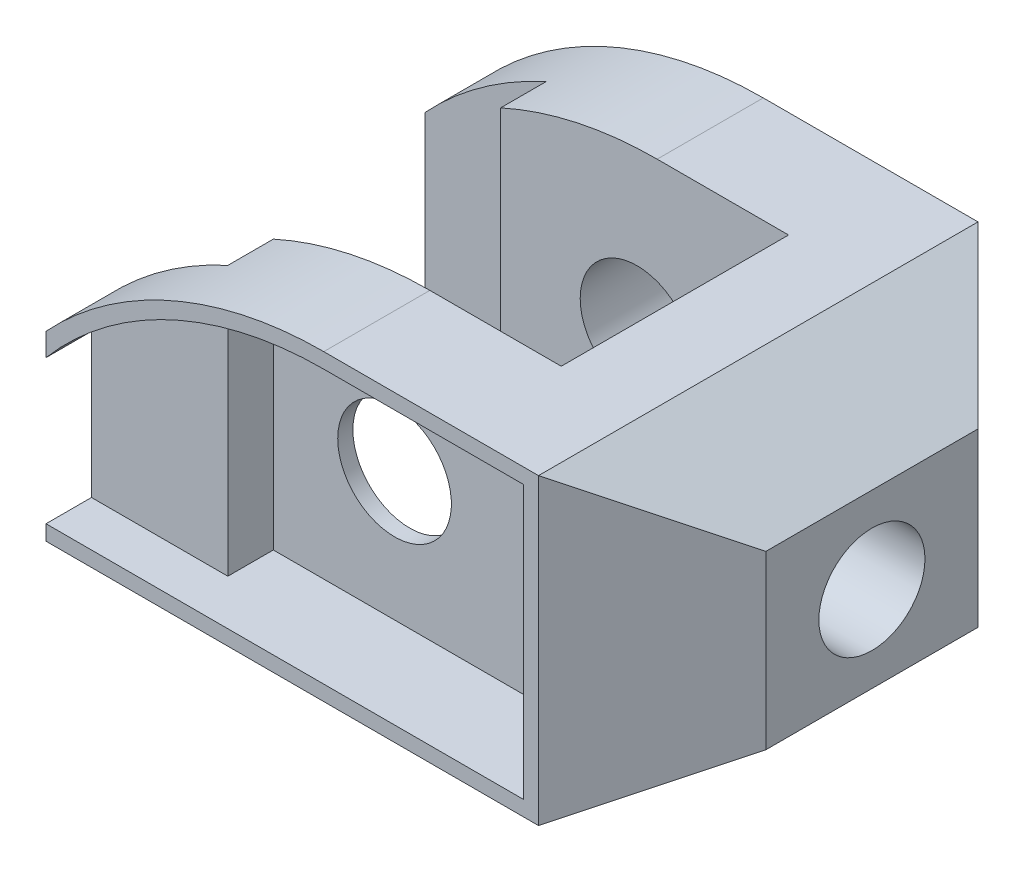
ISO-10303-21;
HEADER;
FILE_DESCRIPTION(('STEP AP214'),'2;1');
FILE_NAME('part.step','',(''),(''),'','','');
FILE_SCHEMA(('AUTOMOTIVE_DESIGN { 1 0 10303 214 1 1 1 1 }'));
ENDSEC;
DATA;
#1=APPLICATION_CONTEXT('core data for automotive mechanical design processes');
#2=APPLICATION_PROTOCOL_DEFINITION('international standard','automotive_design',2000,#1);
#3=PRODUCT_CONTEXT('',#1,'mechanical');
#4=PRODUCT('Part','Part','',(#3));
#5=PRODUCT_RELATED_PRODUCT_CATEGORY('part','',(#4));
#6=PRODUCT_DEFINITION_FORMATION('','',#4);
#7=PRODUCT_DEFINITION_CONTEXT('part definition',#1,'design');
#8=PRODUCT_DEFINITION('design','',#6,#7);
#9=PRODUCT_DEFINITION_SHAPE('','',#8);
#10=(LENGTH_UNIT() NAMED_UNIT(*) SI_UNIT(.MILLI.,.METRE.));
#11=(NAMED_UNIT(*) PLANE_ANGLE_UNIT() SI_UNIT($,.RADIAN.));
#12=(NAMED_UNIT(*) SI_UNIT($,.STERADIAN.) SOLID_ANGLE_UNIT());
#13=UNCERTAINTY_MEASURE_WITH_UNIT(LENGTH_MEASURE(1.E-05),#10,'distance_accuracy_value','');
#14=(GEOMETRIC_REPRESENTATION_CONTEXT(3) GLOBAL_UNCERTAINTY_ASSIGNED_CONTEXT((#13)) GLOBAL_UNIT_ASSIGNED_CONTEXT((#10,
#11,#12)) REPRESENTATION_CONTEXT('',''));
#15=CARTESIAN_POINT('',(0.,0.,0.));
#16=DIRECTION('',(0.,0.,1.));
#17=DIRECTION('',(1.,0.,0.));
#18=AXIS2_PLACEMENT_3D('',#15,#16,#17);
#19=CARTESIAN_POINT('',(18.,0.,17.));
#20=DIRECTION('',(-1.,0.,0.));
#21=DIRECTION('',(0.,-1.,0.));
#22=AXIS2_PLACEMENT_3D('',#19,#20,#21);
#23=PLANE('',#22);
#24=DIRECTION('',(0.,-1.,0.));
#25=VECTOR('',#24,1.);
#26=CARTESIAN_POINT('',(18.,0.,23.));
#27=LINE('',#26,#25);
#28=CARTESIAN_POINT('',(18.,34.2242218715862,23.));
#29=VERTEX_POINT('',#28);
#30=CARTESIAN_POINT('',(18.,2.,23.));
#31=VERTEX_POINT('',#30);
#32=EDGE_CURVE('E194',#29,#31,#27,.T.);
#33=ORIENTED_EDGE('',*,*,#32,.T.);
#34=DIRECTION('',(0.,0.,1.));
#35=VECTOR('',#34,1.);
#36=CARTESIAN_POINT('',(18.,2.,17.));
#37=LINE('',#36,#35);
#38=CARTESIAN_POINT('',(18.,2.,17.));
#39=VERTEX_POINT('',#38);
#40=EDGE_CURVE('E205',#39,#31,#37,.T.);
#41=ORIENTED_EDGE('',*,*,#40,.F.);
#42=DIRECTION('',(0.,-1.,0.));
#43=VECTOR('',#42,1.);
#44=CARTESIAN_POINT('',(18.,0.,17.));
#45=LINE('',#44,#43);
#46=CARTESIAN_POINT('',(18.,34.2242218715862,17.));
#47=VERTEX_POINT('',#46);
#48=EDGE_CURVE('E415',#47,#39,#45,.T.);
#49=ORIENTED_EDGE('',*,*,#48,.F.);
#50=DIRECTION('',(0.,0.,1.));
#51=VECTOR('',#50,1.);
#52=CARTESIAN_POINT('',(18.,34.2242218715862,17.));
#53=LINE('',#52,#51);
#54=EDGE_CURVE('E207',#47,#29,#53,.T.);
#55=ORIENTED_EDGE('',*,*,#54,.T.);
#56=EDGE_LOOP('',(#33,#41,#49,#55));
#57=FACE_BOUND('',#56,.T.);
#58=ADVANCED_FACE('F37',(#57),#23,.F.);
#59=CARTESIAN_POINT('',(34.,19.,29.));
#60=DIRECTION('',(0.,0.,-1.));
#61=DIRECTION('',(-1.,0.,0.));
#62=AXIS2_PLACEMENT_3D('',#59,#60,#61);
#63=CYLINDRICAL_SURFACE('',#62,7.5);
#64=CARTESIAN_POINT('',(34.,19.,15.));
#65=DIRECTION('',(0.,0.,1.));
#66=DIRECTION('',(1.,0.,0.));
#67=AXIS2_PLACEMENT_3D('',#64,#65,#66);
#68=CIRCLE('',#67,7.5);
#69=CARTESIAN_POINT('',(26.5,19.,15.));
#70=VERTEX_POINT('',#69);
#71=EDGE_CURVE('E245',#70,#70,#68,.T.);
#72=CARTESIAN_POINT('',(34.,19.,17.));
#73=DIRECTION('',(0.,0.,1.));
#74=DIRECTION('',(1.,0.,0.));
#75=AXIS2_PLACEMENT_3D('',#72,#73,#74);
#76=CIRCLE('',#75,7.5);
#77=CARTESIAN_POINT('',(26.5,19.,17.));
#78=VERTEX_POINT('',#77);
#79=EDGE_CURVE('E405',#78,#78,#76,.F.);
#80=CARTESIAN_POINT('',(26.5,19.,15.));
#81=CARTESIAN_POINT('',(26.5,19.,15.0208333333333));
#82=CARTESIAN_POINT('',(26.5,19.,15.0416666666667));
#83=CARTESIAN_POINT('',(26.5,19.,15.0833333333333));
#84=CARTESIAN_POINT('',(26.5,19.,15.1041666666667));
#85=CARTESIAN_POINT('',(26.5,19.,15.1458333333333));
#86=CARTESIAN_POINT('',(26.5,19.,15.1666666666667));
#87=CARTESIAN_POINT('',(26.5,19.,15.2083333333333));
#88=CARTESIAN_POINT('',(26.5,19.,15.2291666666667));
#89=CARTESIAN_POINT('',(26.5,19.,15.2708333333333));
#90=CARTESIAN_POINT('',(26.5,19.,15.2916666666667));
#91=CARTESIAN_POINT('',(26.5,19.,15.3333333333333));
#92=CARTESIAN_POINT('',(26.5,19.,15.3541666666667));
#93=CARTESIAN_POINT('',(26.5,19.,15.3958333333333));
#94=CARTESIAN_POINT('',(26.5,19.,15.4166666666667));
#95=CARTESIAN_POINT('',(26.5,19.,15.4583333333333));
#96=CARTESIAN_POINT('',(26.5,19.,15.4791666666667));
#97=CARTESIAN_POINT('',(26.5,19.,15.5208333333333));
#98=CARTESIAN_POINT('',(26.5,19.,15.5416666666667));
#99=CARTESIAN_POINT('',(26.5,19.,15.5833333333333));
#100=CARTESIAN_POINT('',(26.5,19.,15.6041666666667));
#101=CARTESIAN_POINT('',(26.5,19.,15.6458333333333));
#102=CARTESIAN_POINT('',(26.5,19.,15.6666666666667));
#103=CARTESIAN_POINT('',(26.5,19.,15.7083333333333));
#104=CARTESIAN_POINT('',(26.5,19.,15.7291666666667));
#105=CARTESIAN_POINT('',(26.5,19.,15.7708333333333));
#106=CARTESIAN_POINT('',(26.5,19.,15.7916666666667));
#107=CARTESIAN_POINT('',(26.5,19.,15.8333333333333));
#108=CARTESIAN_POINT('',(26.5,19.,15.8541666666667));
#109=CARTESIAN_POINT('',(26.5,19.,15.8958333333333));
#110=CARTESIAN_POINT('',(26.5,19.,15.9166666666667));
#111=CARTESIAN_POINT('',(26.5,19.,15.9583333333333));
#112=CARTESIAN_POINT('',(26.5,19.,15.9791666666667));
#113=CARTESIAN_POINT('',(26.5,19.,16.0208333333333));
#114=CARTESIAN_POINT('',(26.5,19.,16.0416666666667));
#115=CARTESIAN_POINT('',(26.5,19.,16.0833333333333));
#116=CARTESIAN_POINT('',(26.5,19.,16.1041666666667));
#117=CARTESIAN_POINT('',(26.5,19.,16.1458333333333));
#118=CARTESIAN_POINT('',(26.5,19.,16.1666666666667));
#119=CARTESIAN_POINT('',(26.5,19.,16.2083333333333));
#120=CARTESIAN_POINT('',(26.5,19.,16.2291666666667));
#121=CARTESIAN_POINT('',(26.5,19.,16.2708333333333));
#122=CARTESIAN_POINT('',(26.5,19.,16.2916666666667));
#123=CARTESIAN_POINT('',(26.5,19.,16.3333333333333));
#124=CARTESIAN_POINT('',(26.5,19.,16.3541666666667));
#125=CARTESIAN_POINT('',(26.5,19.,16.3958333333333));
#126=CARTESIAN_POINT('',(26.5,19.,16.4166666666667));
#127=CARTESIAN_POINT('',(26.5,19.,16.4583333333333));
#128=CARTESIAN_POINT('',(26.5,19.,16.4791666666667));
#129=CARTESIAN_POINT('',(26.5,19.,16.5208333333333));
#130=CARTESIAN_POINT('',(26.5,19.,16.5416666666667));
#131=CARTESIAN_POINT('',(26.5,19.,16.5833333333333));
#132=CARTESIAN_POINT('',(26.5,19.,16.6041666666667));
#133=CARTESIAN_POINT('',(26.5,19.,16.6458333333333));
#134=CARTESIAN_POINT('',(26.5,19.,16.6666666666667));
#135=CARTESIAN_POINT('',(26.5,19.,16.7083333333333));
#136=CARTESIAN_POINT('',(26.5,19.,16.7291666666667));
#137=CARTESIAN_POINT('',(26.5,19.,16.7708333333333));
#138=CARTESIAN_POINT('',(26.5,19.,16.7916666666667));
#139=CARTESIAN_POINT('',(26.5,19.,16.8333333333333));
#140=CARTESIAN_POINT('',(26.5,19.,16.8541666666667));
#141=CARTESIAN_POINT('',(26.5,19.,16.8958333333333));
#142=CARTESIAN_POINT('',(26.5,19.,16.9166666666667));
#143=CARTESIAN_POINT('',(26.5,19.,16.9583333333333));
#144=CARTESIAN_POINT('',(26.5,19.,16.9791666666667));
#145=CARTESIAN_POINT('',(26.5,19.,17.));
#146=B_SPLINE_CURVE_WITH_KNOTS('',3,(#80,#81,#82,#83,#84,#85,#86,#87,#88,#89,#90,#91,#92,#93,
#94,#95,#96,#97,#98,#99,#100,#101,#102,#103,#104,#105,#106,#107,#108,#109,#110,#111,#112,#113,
#114,#115,#116,#117,#118,#119,#120,#121,#122,#123,#124,#125,#126,#127,#128,#129,#130,#131,#132,
#133,#134,#135,#136,#137,#138,#139,#140,#141,#142,#143,#144,#145),.UNSPECIFIED.,.F.,.F.,(4,2,2,
2,2,2,2,2,2,2,2,2,2,2,2,2,2,2,2,2,2,2,2,2,2,2,2,2,2,2,2,2,4),(0.,0.0625000000000001,0.125,
0.1875,0.25,0.3125,0.375,0.4375,0.5,0.562499999999999,0.624999999999999,0.687499999999999,
0.749999999999999,0.812499999999999,0.874999999999999,0.937499999999999,0.999999999999999,
1.0625,1.125,1.1875,1.25,1.3125,1.375,1.4375,1.5,1.5625,1.625,1.6875,1.75,1.8125,1.875,1.9375,
2.),.UNSPECIFIED.);
#147=EDGE_CURVE('BSEAM502',#70,#78,#146,.T.);
#148=ORIENTED_EDGE('',*,*,#71,.F.);
#149=ORIENTED_EDGE('',*,*,#79,.F.);
#150=ORIENTED_EDGE('',*,*,#147,.T.);
#151=ORIENTED_EDGE('',*,*,#147,.F.);
#152=EDGE_LOOP('',(#148,#150,#149,#151));
#153=FACE_BOUND('',#152,.T.);
#154=ADVANCED_FACE('F502',(#153),#63,.F.);
#155=CARTESIAN_POINT('',(36.6606055596467,-10.,29.));
#156=DIRECTION('',(0.,0.,1.));
#157=DIRECTION('',(1.,0.,0.));
#158=AXIS2_PLACEMENT_3D('',#155,#156,#157);
#159=PLANE('',#158);
#160=DIRECTION('',(1.,0.,0.));
#161=VECTOR('',#160,1.);
#162=CARTESIAN_POINT('',(0.,2.,29.));
#163=LINE('',#162,#161);
#164=CARTESIAN_POINT('',(0.,2.,29.));
#165=VERTEX_POINT('',#164);
#166=CARTESIAN_POINT('',(63.,2.,29.));
#167=VERTEX_POINT('',#166);
#168=EDGE_CURVE('E422',#165,#167,#163,.T.);
#169=ORIENTED_EDGE('',*,*,#168,.F.);
#170=DIRECTION('',(0.,-1.,0.));
#171=VECTOR('',#170,1.);
#172=CARTESIAN_POINT('',(0.,0.,29.));
#173=LINE('',#172,#171);
#174=CARTESIAN_POINT('',(0.,0.,29.));
#175=VERTEX_POINT('',#174);
#176=EDGE_CURVE('E307',#165,#175,#173,.T.);
#177=ORIENTED_EDGE('',*,*,#176,.T.);
#178=DIRECTION('',(1.,0.,0.));
#179=VECTOR('',#178,1.);
#180=CARTESIAN_POINT('',(0.,0.,29.));
#181=LINE('',#180,#179);
#182=CARTESIAN_POINT('',(65.,0.,29.));
#183=VERTEX_POINT('',#182);
#184=EDGE_CURVE('E306',#175,#183,#181,.T.);
#185=ORIENTED_EDGE('',*,*,#184,.T.);
#186=DIRECTION('',(0.,-1.,0.));
#187=VECTOR('',#186,1.);
#188=CARTESIAN_POINT('',(65.,72.,29.));
#189=LINE('',#188,#187);
#190=CARTESIAN_POINT('',(65.,40.,29.));
#191=VERTEX_POINT('',#190);
#192=EDGE_CURVE('E227',#191,#183,#189,.T.);
#193=ORIENTED_EDGE('',*,*,#192,.F.);
#194=DIRECTION('',(-1.,0.,0.));
#195=VECTOR('',#194,1.);
#196=CARTESIAN_POINT('',(65.,40.,29.));
#197=LINE('',#196,#195);
#198=CARTESIAN_POINT('',(36.6606055596467,40.,29.));
#199=VERTEX_POINT('',#198);
#200=EDGE_CURVE('E310',#191,#199,#197,.T.);
#201=ORIENTED_EDGE('',*,*,#200,.T.);
#202=CARTESIAN_POINT('',(36.6606055596467,-10.,29.));
#203=DIRECTION('',(0.,0.,1.));
#204=DIRECTION('',(1.,0.,0.));
#205=AXIS2_PLACEMENT_3D('',#202,#203,#204);
#206=CIRCLE('',#205,50.);
#207=CARTESIAN_POINT('',(0.,24.,29.));
#208=VERTEX_POINT('',#207);
#209=EDGE_CURVE('E312',#199,#208,#206,.T.);
#210=ORIENTED_EDGE('',*,*,#209,.T.);
#211=CARTESIAN_POINT('',(0.,20.9838667696593,29.));
#212=VERTEX_POINT('',#211);
#213=EDGE_CURVE('E303',#208,#212,#173,.T.);
#214=ORIENTED_EDGE('',*,*,#213,.T.);
#215=CARTESIAN_POINT('',(36.6606055596467,-10.,29.));
#216=DIRECTION('',(0.,0.,1.));
#217=DIRECTION('',(1.,0.,0.));
#218=AXIS2_PLACEMENT_3D('',#215,#216,#217);
#219=CIRCLE('',#218,48.);
#220=CARTESIAN_POINT('',(36.6606055596467,38.,29.));
#221=VERTEX_POINT('',#220);
#222=EDGE_CURVE('E394',#221,#212,#219,.T.);
#223=ORIENTED_EDGE('',*,*,#222,.F.);
#224=DIRECTION('',(-1.,0.,0.));
#225=VECTOR('',#224,1.);
#226=CARTESIAN_POINT('',(0.,38.,29.));
#227=LINE('',#226,#225);
#228=CARTESIAN_POINT('',(63.,38.,29.));
#229=VERTEX_POINT('',#228);
#230=EDGE_CURVE('E61',#229,#221,#227,.T.);
#231=ORIENTED_EDGE('',*,*,#230,.F.);
#232=DIRECTION('',(0.,1.,0.));
#233=VECTOR('',#232,1.);
#234=CARTESIAN_POINT('',(63.,0.,29.));
#235=LINE('',#234,#233);
#236=EDGE_CURVE('E409',#167,#229,#235,.T.);
#237=ORIENTED_EDGE('',*,*,#236,.F.);
#238=EDGE_LOOP('',(#169,#177,#185,#193,#201,#210,#214,#223,#231,#237));
#239=FACE_BOUND('',#238,.T.);
#240=ADVANCED_FACE('F377',(#239),#159,.T.);
#241=CARTESIAN_POINT('',(36.6606055596467,-10.,-29.));
#242=DIRECTION('',(0.,0.,1.));
#243=DIRECTION('',(1.,0.,0.));
#244=AXIS2_PLACEMENT_3D('',#241,#242,#243);
#245=PLANE('',#244);
#246=CARTESIAN_POINT('',(34.,19.,-29.));
#247=DIRECTION('',(0.,0.,1.));
#248=DIRECTION('',(1.,0.,0.));
#249=AXIS2_PLACEMENT_3D('',#246,#247,#248);
#250=CIRCLE('',#249,7.5);
#251=CARTESIAN_POINT('',(26.5,19.,-29.));
#252=VERTEX_POINT('',#251);
#253=EDGE_CURVE('E299',#252,#252,#250,.T.);
#254=ORIENTED_EDGE('',*,*,#253,.T.);
#255=EDGE_LOOP('',(#254));
#256=FACE_BOUND('',#255,.T.);
#257=DIRECTION('',(0.,-1.,0.));
#258=VECTOR('',#257,1.);
#259=CARTESIAN_POINT('',(65.,72.,-29.));
#260=LINE('',#259,#258);
#261=CARTESIAN_POINT('',(65.,40.,-29.));
#262=VERTEX_POINT('',#261);
#263=CARTESIAN_POINT('',(65.,0.,-29.));
#264=VERTEX_POINT('',#263);
#265=EDGE_CURVE('E230',#262,#264,#260,.T.);
#266=ORIENTED_EDGE('',*,*,#265,.T.);
#267=DIRECTION('',(1.,0.,0.));
#268=VECTOR('',#267,1.);
#269=CARTESIAN_POINT('',(0.,0.,-29.));
#270=LINE('',#269,#268);
#271=CARTESIAN_POINT('',(0.,0.,-29.));
#272=VERTEX_POINT('',#271);
#273=EDGE_CURVE('E317',#272,#264,#270,.T.);
#274=ORIENTED_EDGE('',*,*,#273,.F.);
#275=DIRECTION('',(0.,-1.,0.));
#276=VECTOR('',#275,1.);
#277=CARTESIAN_POINT('',(0.,0.,-29.));
#278=LINE('',#277,#276);
#279=CARTESIAN_POINT('',(0.,24.,-29.));
#280=VERTEX_POINT('',#279);
#281=EDGE_CURVE('E302',#280,#272,#278,.T.);
#282=ORIENTED_EDGE('',*,*,#281,.F.);
#283=CARTESIAN_POINT('',(36.6606055596467,-10.,-29.));
#284=DIRECTION('',(0.,0.,1.));
#285=DIRECTION('',(1.,0.,0.));
#286=AXIS2_PLACEMENT_3D('',#283,#284,#285);
#287=CIRCLE('',#286,50.);
#288=CARTESIAN_POINT('',(36.6606055596467,40.,-29.));
#289=VERTEX_POINT('',#288);
#290=EDGE_CURVE('E323',#289,#280,#287,.T.);
#291=ORIENTED_EDGE('',*,*,#290,.F.);
#292=DIRECTION('',(-1.,0.,0.));
#293=VECTOR('',#292,1.);
#294=CARTESIAN_POINT('',(65.,40.,-29.));
#295=LINE('',#294,#293);
#296=EDGE_CURVE('E320',#262,#289,#295,.T.);
#297=ORIENTED_EDGE('',*,*,#296,.F.);
#298=EDGE_LOOP('',(#266,#274,#282,#291,#297));
#299=FACE_BOUND('',#298,.T.);
#300=ADVANCED_FACE('F457',(#256,#299),#245,.F.);
#301=CARTESIAN_POINT('',(65.,0.,29.));
#302=DIRECTION('',(-0.500000000000001,0.866025403784438,0.));
#303=DIRECTION('',(-0.866025403784438,-0.500000000000001,0.));
#304=AXIS2_PLACEMENT_3D('',#301,#302,#303);
#305=PLANE('',#304);
#306=DIRECTION('',(-0.65465367070798,-0.37796447300923,-0.654653670707973));
#307=VECTOR('',#306,1.);
#308=CARTESIAN_POINT('',(89.8571428571428,14.3512781198564,-4.14285714285749));
#309=LINE('',#308,#307);
#310=CARTESIAN_POINT('',(80.,8.66025403784441,-14.0000000000002));
#311=VERTEX_POINT('',#310);
#312=EDGE_CURVE('E239',#311,#264,#309,.T.);
#313=ORIENTED_EDGE('',*,*,#312,.F.);
#314=DIRECTION('',(0.,0.,-1.));
#315=VECTOR('',#314,1.);
#316=CARTESIAN_POINT('',(80.,8.66025403784442,29.));
#317=LINE('',#316,#315);
#318=CARTESIAN_POINT('',(80.,8.66025403784441,14.0000000000002));
#319=VERTEX_POINT('',#318);
#320=EDGE_CURVE('E339',#319,#311,#317,.T.);
#321=ORIENTED_EDGE('',*,*,#320,.F.);
#322=DIRECTION('',(0.65465367070798,0.37796447300923,-0.654653670707973));
#323=VECTOR('',#322,1.);
#324=CARTESIAN_POINT('',(65.,0.,29.));
#325=LINE('',#324,#323);
#326=EDGE_CURVE('E234',#183,#319,#325,.T.);
#327=ORIENTED_EDGE('',*,*,#326,.F.);
#328=DIRECTION('',(0.,0.,-1.));
#329=VECTOR('',#328,1.);
#330=CARTESIAN_POINT('',(65.,0.,29.));
#331=LINE('',#330,#329);
#332=EDGE_CURVE('E342',#183,#264,#331,.T.);
#333=ORIENTED_EDGE('',*,*,#332,.T.);
#334=EDGE_LOOP('',(#313,#321,#327,#333));
#335=FACE_BOUND('',#334,.T.);
#336=ADVANCED_FACE('F443',(#335),#305,.F.);
#337=CARTESIAN_POINT('',(80.,8.66025403784442,29.));
#338=DIRECTION('',(-1.,0.,0.));
#339=DIRECTION('',(0.,0.,1.));
#340=AXIS2_PLACEMENT_3D('',#337,#338,#339);
#341=PLANE('',#340);
#342=CARTESIAN_POINT('',(80.,20.,0.));
#343=DIRECTION('',(-1.,0.,0.));
#344=DIRECTION('',(0.,0.,1.));
#345=AXIS2_PLACEMENT_3D('',#342,#343,#344);
#346=CIRCLE('',#345,7.);
#347=CARTESIAN_POINT('',(80.,20.,7.));
#348=VERTEX_POINT('',#347);
#349=EDGE_CURVE('E224',#348,#348,#346,.T.);
#350=ORIENTED_EDGE('',*,*,#349,.T.);
#351=EDGE_LOOP('',(#350));
#352=FACE_BOUND('',#351,.T.);
#353=DIRECTION('',(0.,-1.,0.));
#354=VECTOR('',#353,1.);
#355=CARTESIAN_POINT('',(80.,72.,-14.0000000000002));
#356=LINE('',#355,#354);
#357=CARTESIAN_POINT('',(80.,31.3397459621556,-14.0000000000002));
#358=VERTEX_POINT('',#357);
#359=EDGE_CURVE('E228',#358,#311,#356,.T.);
#360=ORIENTED_EDGE('',*,*,#359,.F.);
#361=DIRECTION('',(0.,0.,-1.));
#362=VECTOR('',#361,1.);
#363=CARTESIAN_POINT('',(80.,31.3397459621556,29.));
#364=LINE('',#363,#362);
#365=CARTESIAN_POINT('',(80.,31.3397459621556,14.0000000000002));
#366=VERTEX_POINT('',#365);
#367=EDGE_CURVE('E336',#366,#358,#364,.T.);
#368=ORIENTED_EDGE('',*,*,#367,.F.);
#369=DIRECTION('',(0.,-1.,0.));
#370=VECTOR('',#369,1.);
#371=CARTESIAN_POINT('',(80.,72.,14.0000000000002));
#372=LINE('',#371,#370);
#373=EDGE_CURVE('E231',#366,#319,#372,.T.);
#374=ORIENTED_EDGE('',*,*,#373,.T.);
#375=ORIENTED_EDGE('',*,*,#320,.T.);
#376=EDGE_LOOP('',(#360,#368,#374,#375));
#377=FACE_BOUND('',#376,.T.);
#378=ADVANCED_FACE('F440',(#352,#377),#341,.F.);
#379=CARTESIAN_POINT('',(80.,31.3397459621556,29.));
#380=DIRECTION('',(-0.500000000000001,-0.866025403784438,0.));
#381=DIRECTION('',(0.866025403784438,-0.500000000000001,0.));
#382=AXIS2_PLACEMENT_3D('',#379,#380,#381);
#383=PLANE('',#382);
#384=DIRECTION('',(0.65465367070798,-0.37796447300923,0.654653670707973));
#385=VECTOR('',#384,1.);
#386=CARTESIAN_POINT('',(98.4285714285714,20.7000052870896,4.42857142857107));
#387=LINE('',#386,#385);
#388=EDGE_CURVE('E11',#262,#358,#387,.T.);
#389=ORIENTED_EDGE('',*,*,#388,.F.);
#390=DIRECTION('',(0.,0.,-1.));
#391=VECTOR('',#390,1.);
#392=CARTESIAN_POINT('',(65.,40.,29.));
#393=LINE('',#392,#391);
#394=EDGE_CURVE('E333',#191,#262,#393,.T.);
#395=ORIENTED_EDGE('',*,*,#394,.F.);
#396=DIRECTION('',(-0.65465367070798,0.37796447300923,0.654653670707973));
#397=VECTOR('',#396,1.);
#398=CARTESIAN_POINT('',(73.5714285714287,35.051283406946,20.4285714285714));
#399=LINE('',#398,#397);
#400=EDGE_CURVE('E46',#366,#191,#399,.T.);
#401=ORIENTED_EDGE('',*,*,#400,.F.);
#402=ORIENTED_EDGE('',*,*,#367,.T.);
#403=EDGE_LOOP('',(#389,#395,#401,#402));
#404=FACE_BOUND('',#403,.T.);
#405=ADVANCED_FACE('F383',(#404),#383,.F.);
#406=CARTESIAN_POINT('',(0.,0.,29.));
#407=DIRECTION('',(1.,0.,0.));
#408=DIRECTION('',(0.,0.,-1.));
#409=AXIS2_PLACEMENT_3D('',#406,#407,#408);
#410=PLANE('',#409);
#411=DIRECTION('',(0.,0.,-1.));
#412=VECTOR('',#411,1.);
#413=CARTESIAN_POINT('',(0.,0.,29.));
#414=LINE('',#413,#412);
#415=CARTESIAN_POINT('',(0.,0.,-21.));
#416=VERTEX_POINT('',#415);
#417=EDGE_CURVE('E345',#416,#272,#414,.T.);
#418=ORIENTED_EDGE('',*,*,#417,.F.);
#419=DIRECTION('',(0.,1.,0.));
#420=VECTOR('',#419,1.);
#421=CARTESIAN_POINT('',(0.,-1.2E-05,-21.));
#422=LINE('',#421,#420);
#423=CARTESIAN_POINT('',(0.,24.,-21.));
#424=VERTEX_POINT('',#423);
#425=EDGE_CURVE('E242',#416,#424,#422,.T.);
#426=ORIENTED_EDGE('',*,*,#425,.T.);
#427=DIRECTION('',(0.,0.,-1.));
#428=VECTOR('',#427,1.);
#429=CARTESIAN_POINT('',(0.,24.,29.));
#430=LINE('',#429,#428);
#431=EDGE_CURVE('E314',#424,#280,#430,.T.);
#432=ORIENTED_EDGE('',*,*,#431,.T.);
#433=ORIENTED_EDGE('',*,*,#281,.T.);
#434=EDGE_LOOP('',(#418,#426,#432,#433));
#435=FACE_BOUND('',#434,.T.);
#436=ADVANCED_FACE('F460',(#435),#410,.F.);
#437=CARTESIAN_POINT('',(36.6606055596467,-10.,29.));
#438=DIRECTION('',(0.,0.,-1.));
#439=DIRECTION('',(-1.,0.,0.));
#440=AXIS2_PLACEMENT_3D('',#437,#438,#439);
#441=CYLINDRICAL_SURFACE('',#440,50.);
#442=ORIENTED_EDGE('',*,*,#431,.F.);
#443=CARTESIAN_POINT('',(36.6606055596467,-10.,-21.));
#444=DIRECTION('',(0.,0.,-1.));
#445=DIRECTION('',(-1.,0.,0.));
#446=AXIS2_PLACEMENT_3D('',#443,#444,#445);
#447=CIRCLE('',#446,50.);
#448=CARTESIAN_POINT('',(16.,35.5317403347236,-21.));
#449=VERTEX_POINT('',#448);
#450=EDGE_CURVE('E362',#424,#449,#447,.T.);
#451=ORIENTED_EDGE('',*,*,#450,.T.);
#452=DIRECTION('',(0.,0.,-1.));
#453=VECTOR('',#452,1.);
#454=CARTESIAN_POINT('',(16.,35.5317403347236,29.));
#455=LINE('',#454,#453);
#456=CARTESIAN_POINT('',(16.,35.5317403347236,-15.));
#457=VERTEX_POINT('',#456);
#458=EDGE_CURVE('E359',#449,#457,#455,.F.);
#459=ORIENTED_EDGE('',*,*,#458,.T.);
#460=CARTESIAN_POINT('',(36.6606055596467,-10.,-15.));
#461=DIRECTION('',(0.,0.,-1.));
#462=DIRECTION('',(-1.,0.,0.));
#463=AXIS2_PLACEMENT_3D('',#460,#461,#462);
#464=CIRCLE('',#463,50.);
#465=CARTESIAN_POINT('',(36.6606055596467,40.,-15.));
#466=VERTEX_POINT('',#465);
#467=EDGE_CURVE('E275',#457,#466,#464,.T.);
#468=ORIENTED_EDGE('',*,*,#467,.T.);
#469=DIRECTION('',(0.,0.,-1.));
#470=VECTOR('',#469,1.);
#471=CARTESIAN_POINT('',(36.6606055596467,40.,29.));
#472=LINE('',#471,#470);
#473=EDGE_CURVE('E329',#466,#289,#472,.T.);
#474=ORIENTED_EDGE('',*,*,#473,.T.);
#475=ORIENTED_EDGE('',*,*,#290,.T.);
#476=EDGE_LOOP('',(#442,#451,#459,#468,#474,#475));
#477=FACE_BOUND('',#476,.T.);
#478=ADVANCED_FACE('F463',(#477),#441,.T.);
#479=CARTESIAN_POINT('',(34.,19.,-15.));
#480=DIRECTION('',(0.,0.,-1.));
#481=DIRECTION('',(-1.,0.,0.));
#482=AXIS2_PLACEMENT_3D('',#479,#480,#481);
#483=CIRCLE('',#482,7.5);
#484=CARTESIAN_POINT('',(26.5,19.,-15.));
#485=VERTEX_POINT('',#484);
#486=EDGE_CURVE('E274',#485,#485,#483,.T.);
#487=CARTESIAN_POINT('',(26.5,19.,-15.));
#488=CARTESIAN_POINT('',(26.5,19.,-15.1458333333333));
#489=CARTESIAN_POINT('',(26.5,19.,-15.2916666666667));
#490=CARTESIAN_POINT('',(26.5,19.,-15.5833333333333));
#491=CARTESIAN_POINT('',(26.5,19.,-15.7291666666667));
#492=CARTESIAN_POINT('',(26.5,19.,-16.0208333333333));
#493=CARTESIAN_POINT('',(26.5,19.,-16.1666666666667));
#494=CARTESIAN_POINT('',(26.5,19.,-16.4583333333333));
#495=CARTESIAN_POINT('',(26.5,19.,-16.6041666666667));
#496=CARTESIAN_POINT('',(26.5,19.,-16.8958333333333));
#497=CARTESIAN_POINT('',(26.5,19.,-17.0416666666667));
#498=CARTESIAN_POINT('',(26.5,19.,-17.3333333333333));
#499=CARTESIAN_POINT('',(26.5,19.,-17.4791666666667));
#500=CARTESIAN_POINT('',(26.5,19.,-17.7708333333333));
#501=CARTESIAN_POINT('',(26.5,19.,-17.9166666666667));
#502=CARTESIAN_POINT('',(26.5,19.,-18.2083333333333));
#503=CARTESIAN_POINT('',(26.5,19.,-18.3541666666667));
#504=CARTESIAN_POINT('',(26.5,19.,-18.6458333333333));
#505=CARTESIAN_POINT('',(26.5,19.,-18.7916666666667));
#506=CARTESIAN_POINT('',(26.5,19.,-19.0833333333333));
#507=CARTESIAN_POINT('',(26.5,19.,-19.2291666666667));
#508=CARTESIAN_POINT('',(26.5,19.,-19.5208333333333));
#509=CARTESIAN_POINT('',(26.5,19.,-19.6666666666667));
#510=CARTESIAN_POINT('',(26.5,19.,-19.9583333333333));
#511=CARTESIAN_POINT('',(26.5,19.,-20.1041666666667));
#512=CARTESIAN_POINT('',(26.5,19.,-20.3958333333333));
#513=CARTESIAN_POINT('',(26.5,19.,-20.5416666666667));
#514=CARTESIAN_POINT('',(26.5,19.,-20.8333333333333));
#515=CARTESIAN_POINT('',(26.5,19.,-20.9791666666667));
#516=CARTESIAN_POINT('',(26.5,19.,-21.2708333333333));
#517=CARTESIAN_POINT('',(26.5,19.,-21.4166666666667));
#518=CARTESIAN_POINT('',(26.5,19.,-21.7083333333333));
#519=CARTESIAN_POINT('',(26.5,19.,-21.8541666666667));
#520=CARTESIAN_POINT('',(26.5,19.,-22.1458333333333));
#521=CARTESIAN_POINT('',(26.5,19.,-22.2916666666667));
#522=CARTESIAN_POINT('',(26.5,19.,-22.5833333333333));
#523=CARTESIAN_POINT('',(26.5,19.,-22.7291666666667));
#524=CARTESIAN_POINT('',(26.5,19.,-23.0208333333333));
#525=CARTESIAN_POINT('',(26.5,19.,-23.1666666666667));
#526=CARTESIAN_POINT('',(26.5,19.,-23.4583333333333));
#527=CARTESIAN_POINT('',(26.5,19.,-23.6041666666667));
#528=CARTESIAN_POINT('',(26.5,19.,-23.8958333333333));
#529=CARTESIAN_POINT('',(26.5,19.,-24.0416666666667));
#530=CARTESIAN_POINT('',(26.5,19.,-24.3333333333333));
#531=CARTESIAN_POINT('',(26.5,19.,-24.4791666666667));
#532=CARTESIAN_POINT('',(26.5,19.,-24.7708333333333));
#533=CARTESIAN_POINT('',(26.5,19.,-24.9166666666667));
#534=CARTESIAN_POINT('',(26.5,19.,-25.2083333333333));
#535=CARTESIAN_POINT('',(26.5,19.,-25.3541666666667));
#536=CARTESIAN_POINT('',(26.5,19.,-25.6458333333333));
#537=CARTESIAN_POINT('',(26.5,19.,-25.7916666666667));
#538=CARTESIAN_POINT('',(26.5,19.,-26.0833333333333));
#539=CARTESIAN_POINT('',(26.5,19.,-26.2291666666667));
#540=CARTESIAN_POINT('',(26.5,19.,-26.5208333333333));
#541=CARTESIAN_POINT('',(26.5,19.,-26.6666666666667));
#542=CARTESIAN_POINT('',(26.5,19.,-26.9583333333333));
#543=CARTESIAN_POINT('',(26.5,19.,-27.1041666666667));
#544=CARTESIAN_POINT('',(26.5,19.,-27.3958333333333));
#545=CARTESIAN_POINT('',(26.5,19.,-27.5416666666667));
#546=CARTESIAN_POINT('',(26.5,19.,-27.8333333333333));
#547=CARTESIAN_POINT('',(26.5,19.,-27.9791666666667));
#548=CARTESIAN_POINT('',(26.5,19.,-28.2708333333333));
#549=CARTESIAN_POINT('',(26.5,19.,-28.4166666666667));
#550=CARTESIAN_POINT('',(26.5,19.,-28.7083333333333));
#551=CARTESIAN_POINT('',(26.5,19.,-28.8541666666667));
#552=CARTESIAN_POINT('',(26.5,19.,-29.));
#553=B_SPLINE_CURVE_WITH_KNOTS('',3,(#487,#488,#489,#490,#491,#492,#493,#494,#495,#496,#497,
#498,#499,#500,#501,#502,#503,#504,#505,#506,#507,#508,#509,#510,#511,#512,#513,#514,#515,#516,
#517,#518,#519,#520,#521,#522,#523,#524,#525,#526,#527,#528,#529,#530,#531,#532,#533,#534,#535,
#536,#537,#538,#539,#540,#541,#542,#543,#544,#545,#546,#547,#548,#549,#550,#551,#552),
.UNSPECIFIED.,.F.,.F.,(4,2,2,2,2,2,2,2,2,2,2,2,2,2,2,2,2,2,2,2,2,2,2,2,2,2,2,2,2,2,2,2,4),(0.,
0.4375,0.875000000000001,1.3125,1.75,2.1875,2.625,3.0625,3.5,3.9375,4.375,4.8125,5.25,
5.68750000000001,6.12500000000001,6.56250000000001,7.00000000000001,7.43750000000001,
7.87500000000001,8.31250000000001,8.75000000000001,9.18750000000001,9.62500000000001,10.0625,
10.5,10.9375,11.375,11.8125,12.25,12.6875,13.125,13.5625,14.),.UNSPECIFIED.);
#554=EDGE_CURVE('BSEAM510',#485,#252,#553,.T.);
#555=ORIENTED_EDGE('',*,*,#486,.F.);
#556=ORIENTED_EDGE('',*,*,#253,.F.);
#557=ORIENTED_EDGE('',*,*,#554,.T.);
#558=ORIENTED_EDGE('',*,*,#554,.F.);
#559=EDGE_LOOP('',(#555,#557,#556,#558));
#560=FACE_BOUND('',#559,.T.);
#561=ADVANCED_FACE('F510',(#560),#63,.F.);
#562=ORIENTED_EDGE('',*,*,#176,.F.);
#563=DIRECTION('',(0.,0.,1.));
#564=VECTOR('',#563,1.);
#565=CARTESIAN_POINT('',(0.,2.,23.));
#566=LINE('',#565,#564);
#567=CARTESIAN_POINT('',(0.,2.,23.));
#568=VERTEX_POINT('',#567);
#569=EDGE_CURVE('E400',#568,#165,#566,.T.);
#570=ORIENTED_EDGE('',*,*,#569,.F.);
#571=DIRECTION('',(0.,-1.,0.));
#572=VECTOR('',#571,1.);
#573=CARTESIAN_POINT('',(0.,0.,23.));
#574=LINE('',#573,#572);
#575=CARTESIAN_POINT('',(0.,20.9838667696593,23.));
#576=VERTEX_POINT('',#575);
#577=EDGE_CURVE('E197',#576,#568,#574,.T.);
#578=ORIENTED_EDGE('',*,*,#577,.F.);
#579=DIRECTION('',(0.,0.,1.));
#580=VECTOR('',#579,1.);
#581=CARTESIAN_POINT('',(0.,20.9838667696593,23.));
#582=LINE('',#581,#580);
#583=EDGE_CURVE('E399',#576,#212,#582,.T.);
#584=ORIENTED_EDGE('',*,*,#583,.T.);
#585=ORIENTED_EDGE('',*,*,#213,.F.);
#586=CARTESIAN_POINT('',(0.,24.,21.));
#587=VERTEX_POINT('',#586);
#588=EDGE_CURVE('E326',#208,#587,#430,.T.);
#589=ORIENTED_EDGE('',*,*,#588,.T.);
#590=DIRECTION('',(0.,1.,0.));
#591=VECTOR('',#590,1.);
#592=CARTESIAN_POINT('',(0.,-1.2E-05,21.));
#593=LINE('',#592,#591);
#594=CARTESIAN_POINT('',(0.,0.,21.));
#595=VERTEX_POINT('',#594);
#596=EDGE_CURVE('E241',#595,#587,#593,.T.);
#597=ORIENTED_EDGE('',*,*,#596,.F.);
#598=EDGE_CURVE('E346',#175,#595,#414,.T.);
#599=ORIENTED_EDGE('',*,*,#598,.F.);
#600=EDGE_LOOP('',(#562,#570,#578,#584,#585,#589,#597,#599));
#601=FACE_BOUND('',#600,.T.);
#602=ADVANCED_FACE('F39',(#601),#410,.F.);
#603=CARTESIAN_POINT('',(0.,0.,29.));
#604=DIRECTION('',(0.,1.,0.));
#605=DIRECTION('',(0.,0.,1.));
#606=AXIS2_PLACEMENT_3D('',#603,#604,#605);
#607=PLANE('',#606);
#608=DIRECTION('',(0.,0.,-1.));
#609=VECTOR('',#608,1.);
#610=CARTESIAN_POINT('',(16.,0.,29.));
#611=LINE('',#610,#609);
#612=CARTESIAN_POINT('',(16.,0.,-15.));
#613=VERTEX_POINT('',#612);
#614=CARTESIAN_POINT('',(16.,0.,-21.));
#615=VERTEX_POINT('',#614);
#616=EDGE_CURVE('E290',#613,#615,#611,.T.);
#617=ORIENTED_EDGE('',*,*,#616,.T.);
#618=DIRECTION('',(-1.,0.,0.));
#619=VECTOR('',#618,1.);
#620=CARTESIAN_POINT('',(0.,0.,-21.));
#621=LINE('',#620,#619);
#622=EDGE_CURVE('E293',#615,#416,#621,.T.);
#623=ORIENTED_EDGE('',*,*,#622,.T.);
#624=ORIENTED_EDGE('',*,*,#417,.T.);
#625=ORIENTED_EDGE('',*,*,#273,.T.);
#626=ORIENTED_EDGE('',*,*,#332,.F.);
#627=ORIENTED_EDGE('',*,*,#184,.F.);
#628=ORIENTED_EDGE('',*,*,#598,.T.);
#629=DIRECTION('',(1.,0.,0.));
#630=VECTOR('',#629,1.);
#631=CARTESIAN_POINT('',(0.,0.,21.));
#632=LINE('',#631,#630);
#633=CARTESIAN_POINT('',(16.,0.,21.));
#634=VERTEX_POINT('',#633);
#635=EDGE_CURVE('E284',#595,#634,#632,.T.);
#636=ORIENTED_EDGE('',*,*,#635,.T.);
#637=DIRECTION('',(0.,0.,-1.));
#638=VECTOR('',#637,1.);
#639=CARTESIAN_POINT('',(16.,0.,29.));
#640=LINE('',#639,#638);
#641=CARTESIAN_POINT('',(16.,0.,15.));
#642=VERTEX_POINT('',#641);
#643=EDGE_CURVE('E287',#634,#642,#640,.T.);
#644=ORIENTED_EDGE('',*,*,#643,.T.);
#645=DIRECTION('',(1.,0.,0.));
#646=VECTOR('',#645,1.);
#647=CARTESIAN_POINT('',(0.,0.,15.));
#648=LINE('',#647,#646);
#649=CARTESIAN_POINT('',(54.,0.,15.));
#650=VERTEX_POINT('',#649);
#651=EDGE_CURVE('E271',#642,#650,#648,.T.);
#652=ORIENTED_EDGE('',*,*,#651,.T.);
#653=DIRECTION('',(0.,0.,-1.));
#654=VECTOR('',#653,1.);
#655=CARTESIAN_POINT('',(54.,0.,29.));
#656=LINE('',#655,#654);
#657=CARTESIAN_POINT('',(54.,0.,-15.));
#658=VERTEX_POINT('',#657);
#659=EDGE_CURVE('E296',#650,#658,#656,.T.);
#660=ORIENTED_EDGE('',*,*,#659,.T.);
#661=DIRECTION('',(-1.,0.,0.));
#662=VECTOR('',#661,1.);
#663=CARTESIAN_POINT('',(0.,0.,-15.));
#664=LINE('',#663,#662);
#665=EDGE_CURVE('E281',#658,#613,#664,.T.);
#666=ORIENTED_EDGE('',*,*,#665,.T.);
#667=EDGE_LOOP('',(#617,#623,#624,#625,#626,#627,#628,#636,#644,#652,#660,#666));
#668=FACE_BOUND('',#667,.T.);
#669=ADVANCED_FACE('F451',(#668),#607,.F.);
#670=CARTESIAN_POINT('',(65.,40.,29.));
#671=DIRECTION('',(0.,-1.,0.));
#672=DIRECTION('',(1.,0.,0.));
#673=AXIS2_PLACEMENT_3D('',#670,#671,#672);
#674=PLANE('',#673);
#675=ORIENTED_EDGE('',*,*,#473,.F.);
#676=DIRECTION('',(1.,0.,0.));
#677=VECTOR('',#676,1.);
#678=CARTESIAN_POINT('',(65.,40.,-15.));
#679=LINE('',#678,#677);
#680=CARTESIAN_POINT('',(54.,40.,-15.));
#681=VERTEX_POINT('',#680);
#682=EDGE_CURVE('E278',#466,#681,#679,.T.);
#683=ORIENTED_EDGE('',*,*,#682,.T.);
#684=DIRECTION('',(0.,0.,1.));
#685=VECTOR('',#684,1.);
#686=CARTESIAN_POINT('',(54.,40.,29.));
#687=LINE('',#686,#685);
#688=CARTESIAN_POINT('',(54.,40.,15.));
#689=VERTEX_POINT('',#688);
#690=EDGE_CURVE('E365',#681,#689,#687,.T.);
#691=ORIENTED_EDGE('',*,*,#690,.T.);
#692=DIRECTION('',(-1.,0.,0.));
#693=VECTOR('',#692,1.);
#694=CARTESIAN_POINT('',(65.,40.,15.));
#695=LINE('',#694,#693);
#696=CARTESIAN_POINT('',(36.6606055596467,40.,15.));
#697=VERTEX_POINT('',#696);
#698=EDGE_CURVE('E268',#689,#697,#695,.T.);
#699=ORIENTED_EDGE('',*,*,#698,.T.);
#700=EDGE_CURVE('E330',#199,#697,#472,.T.);
#701=ORIENTED_EDGE('',*,*,#700,.F.);
#702=ORIENTED_EDGE('',*,*,#200,.F.);
#703=ORIENTED_EDGE('',*,*,#394,.T.);
#704=ORIENTED_EDGE('',*,*,#296,.T.);
#705=EDGE_LOOP('',(#675,#683,#691,#699,#701,#702,#703,#704));
#706=FACE_BOUND('',#705,.T.);
#707=ADVANCED_FACE('F387',(#706),#674,.F.);
#708=ORIENTED_EDGE('',*,*,#700,.T.);
#709=CARTESIAN_POINT('',(36.6606055596467,-10.,15.));
#710=DIRECTION('',(0.,0.,1.));
#711=DIRECTION('',(1.,0.,0.));
#712=AXIS2_PLACEMENT_3D('',#709,#710,#711);
#713=CIRCLE('',#712,50.);
#714=CARTESIAN_POINT('',(16.,35.5317403347236,15.));
#715=VERTEX_POINT('',#714);
#716=EDGE_CURVE('E265',#697,#715,#713,.T.);
#717=ORIENTED_EDGE('',*,*,#716,.T.);
#718=DIRECTION('',(0.,0.,-1.));
#719=VECTOR('',#718,1.);
#720=CARTESIAN_POINT('',(16.,35.5317403347236,29.));
#721=LINE('',#720,#719);
#722=CARTESIAN_POINT('',(16.,35.5317403347236,21.));
#723=VERTEX_POINT('',#722);
#724=EDGE_CURVE('E356',#715,#723,#721,.F.);
#725=ORIENTED_EDGE('',*,*,#724,.T.);
#726=CARTESIAN_POINT('',(36.6606055596467,-10.,21.));
#727=DIRECTION('',(0.,0.,1.));
#728=DIRECTION('',(1.,0.,0.));
#729=AXIS2_PLACEMENT_3D('',#726,#727,#728);
#730=CIRCLE('',#729,50.);
#731=EDGE_CURVE('E349',#723,#587,#730,.T.);
#732=ORIENTED_EDGE('',*,*,#731,.T.);
#733=ORIENTED_EDGE('',*,*,#588,.F.);
#734=ORIENTED_EDGE('',*,*,#209,.F.);
#735=EDGE_LOOP('',(#708,#717,#725,#732,#733,#734));
#736=FACE_BOUND('',#735,.T.);
#737=ADVANCED_FACE('F391',(#736),#441,.T.);
#738=CARTESIAN_POINT('',(54.,-1.2E-05,-15.));
#739=DIRECTION('',(1.,0.,0.));
#740=DIRECTION('',(0.,0.,-1.));
#741=AXIS2_PLACEMENT_3D('',#738,#739,#740);
#742=PLANE('',#741);
#743=CARTESIAN_POINT('',(54.,20.,0.));
#744=DIRECTION('',(1.,0.,0.));
#745=DIRECTION('',(0.,0.,-1.));
#746=AXIS2_PLACEMENT_3D('',#743,#744,#745);
#747=CIRCLE('',#746,7.);
#748=CARTESIAN_POINT('',(54.,20.,-7.));
#749=VERTEX_POINT('',#748);
#750=EDGE_CURVE('E41',#749,#749,#747,.T.);
#751=ORIENTED_EDGE('',*,*,#750,.T.);
#752=EDGE_LOOP('',(#751));
#753=FACE_BOUND('',#752,.T.);
#754=DIRECTION('',(0.,1.,0.));
#755=VECTOR('',#754,1.);
#756=CARTESIAN_POINT('',(54.,-1.2E-05,15.));
#757=LINE('',#756,#755);
#758=EDGE_CURVE('E255',#650,#689,#757,.T.);
#759=ORIENTED_EDGE('',*,*,#758,.T.);
#760=ORIENTED_EDGE('',*,*,#690,.F.);
#761=DIRECTION('',(0.,1.,0.));
#762=VECTOR('',#761,1.);
#763=CARTESIAN_POINT('',(54.,-1.2E-05,-15.));
#764=LINE('',#763,#762);
#765=EDGE_CURVE('E252',#658,#681,#764,.T.);
#766=ORIENTED_EDGE('',*,*,#765,.F.);
#767=ORIENTED_EDGE('',*,*,#659,.F.);
#768=EDGE_LOOP('',(#759,#760,#766,#767));
#769=FACE_BOUND('',#768,.T.);
#770=ADVANCED_FACE('F429',(#753,#769),#742,.F.);
#771=CARTESIAN_POINT('',(0.,-1.2E-05,-21.));
#772=DIRECTION('',(0.,0.,-1.));
#773=DIRECTION('',(-1.,0.,0.));
#774=AXIS2_PLACEMENT_3D('',#771,#772,#773);
#775=PLANE('',#774);
#776=DIRECTION('',(0.,1.,0.));
#777=VECTOR('',#776,1.);
#778=CARTESIAN_POINT('',(16.,-1.2E-05,-21.));
#779=LINE('',#778,#777);
#780=EDGE_CURVE('E246',#615,#449,#779,.T.);
#781=ORIENTED_EDGE('',*,*,#780,.T.);
#782=ORIENTED_EDGE('',*,*,#450,.F.);
#783=ORIENTED_EDGE('',*,*,#425,.F.);
#784=ORIENTED_EDGE('',*,*,#622,.F.);
#785=EDGE_LOOP('',(#781,#782,#783,#784));
#786=FACE_BOUND('',#785,.T.);
#787=ADVANCED_FACE('F472',(#786),#775,.F.);
#788=CARTESIAN_POINT('',(16.,-1.2E-05,-21.));
#789=DIRECTION('',(1.,0.,0.));
#790=DIRECTION('',(0.,0.,-1.));
#791=AXIS2_PLACEMENT_3D('',#788,#789,#790);
#792=PLANE('',#791);
#793=DIRECTION('',(0.,1.,0.));
#794=VECTOR('',#793,1.);
#795=CARTESIAN_POINT('',(16.,-1.2E-05,-15.));
#796=LINE('',#795,#794);
#797=EDGE_CURVE('E249',#613,#457,#796,.T.);
#798=ORIENTED_EDGE('',*,*,#797,.T.);
#799=ORIENTED_EDGE('',*,*,#458,.F.);
#800=ORIENTED_EDGE('',*,*,#780,.F.);
#801=ORIENTED_EDGE('',*,*,#616,.F.);
#802=EDGE_LOOP('',(#798,#799,#800,#801));
#803=FACE_BOUND('',#802,.T.);
#804=ADVANCED_FACE('F470',(#803),#792,.F.);
#805=CARTESIAN_POINT('',(16.,-1.2E-05,15.));
#806=DIRECTION('',(1.,0.,0.));
#807=DIRECTION('',(0.,0.,-1.));
#808=AXIS2_PLACEMENT_3D('',#805,#806,#807);
#809=PLANE('',#808);
#810=DIRECTION('',(0.,1.,0.));
#811=VECTOR('',#810,1.);
#812=CARTESIAN_POINT('',(16.,-1.2E-05,21.));
#813=LINE('',#812,#811);
#814=EDGE_CURVE('E261',#634,#723,#813,.T.);
#815=ORIENTED_EDGE('',*,*,#814,.T.);
#816=ORIENTED_EDGE('',*,*,#724,.F.);
#817=DIRECTION('',(0.,1.,0.));
#818=VECTOR('',#817,1.);
#819=CARTESIAN_POINT('',(16.,-1.2E-05,15.));
#820=LINE('',#819,#818);
#821=EDGE_CURVE('E258',#642,#715,#820,.T.);
#822=ORIENTED_EDGE('',*,*,#821,.F.);
#823=ORIENTED_EDGE('',*,*,#643,.F.);
#824=EDGE_LOOP('',(#815,#816,#822,#823));
#825=FACE_BOUND('',#824,.T.);
#826=ADVANCED_FACE('F478',(#825),#809,.F.);
#827=CARTESIAN_POINT('',(0.,-1.2E-05,21.));
#828=DIRECTION('',(0.,0.,1.));
#829=DIRECTION('',(1.,0.,0.));
#830=AXIS2_PLACEMENT_3D('',#827,#828,#829);
#831=PLANE('',#830);
#832=ORIENTED_EDGE('',*,*,#596,.T.);
#833=ORIENTED_EDGE('',*,*,#731,.F.);
#834=ORIENTED_EDGE('',*,*,#814,.F.);
#835=ORIENTED_EDGE('',*,*,#635,.F.);
#836=EDGE_LOOP('',(#832,#833,#834,#835));
#837=FACE_BOUND('',#836,.T.);
#838=ADVANCED_FACE('F481',(#837),#831,.F.);
#839=CARTESIAN_POINT('',(16.,-1.2E-05,-15.));
#840=DIRECTION('',(0.,0.,-1.));
#841=DIRECTION('',(-1.,0.,0.));
#842=AXIS2_PLACEMENT_3D('',#839,#840,#841);
#843=PLANE('',#842);
#844=ORIENTED_EDGE('',*,*,#486,.T.);
#845=EDGE_LOOP('',(#844));
#846=FACE_BOUND('',#845,.T.);
#847=ORIENTED_EDGE('',*,*,#765,.T.);
#848=ORIENTED_EDGE('',*,*,#682,.F.);
#849=ORIENTED_EDGE('',*,*,#467,.F.);
#850=ORIENTED_EDGE('',*,*,#797,.F.);
#851=ORIENTED_EDGE('',*,*,#665,.F.);
#852=EDGE_LOOP('',(#847,#848,#849,#850,#851));
#853=FACE_BOUND('',#852,.T.);
#854=ADVANCED_FACE('F465',(#846,#853),#843,.F.);
#855=CARTESIAN_POINT('',(16.,-1.2E-05,15.));
#856=DIRECTION('',(0.,0.,1.));
#857=DIRECTION('',(1.,0.,0.));
#858=AXIS2_PLACEMENT_3D('',#855,#856,#857);
#859=PLANE('',#858);
#860=ORIENTED_EDGE('',*,*,#71,.T.);
#861=EDGE_LOOP('',(#860));
#862=FACE_BOUND('',#861,.T.);
#863=ORIENTED_EDGE('',*,*,#821,.T.);
#864=ORIENTED_EDGE('',*,*,#716,.F.);
#865=ORIENTED_EDGE('',*,*,#698,.F.);
#866=ORIENTED_EDGE('',*,*,#758,.F.);
#867=ORIENTED_EDGE('',*,*,#651,.F.);
#868=EDGE_LOOP('',(#863,#864,#865,#866,#867));
#869=FACE_BOUND('',#868,.T.);
#870=ADVANCED_FACE('F476',(#862,#869),#859,.F.);
#871=CARTESIAN_POINT('',(65.,72.,29.));
#872=DIRECTION('',(0.707106781186544,0.,0.707106781186551));
#873=DIRECTION('',(0.707106781186551,0.,-0.707106781186544));
#874=AXIS2_PLACEMENT_3D('',#871,#872,#873);
#875=PLANE('',#874);
#876=ORIENTED_EDGE('',*,*,#326,.T.);
#877=ORIENTED_EDGE('',*,*,#373,.F.);
#878=ORIENTED_EDGE('',*,*,#400,.T.);
#879=ORIENTED_EDGE('',*,*,#192,.T.);
#880=EDGE_LOOP('',(#876,#877,#878,#879));
#881=FACE_BOUND('',#880,.T.);
#882=ADVANCED_FACE('F371',(#881),#875,.T.);
#883=CARTESIAN_POINT('',(65.,72.,-29.));
#884=DIRECTION('',(0.707106781186543,0.,-0.707106781186551));
#885=DIRECTION('',(-0.707106781186552,0.,-0.707106781186544));
#886=AXIS2_PLACEMENT_3D('',#883,#884,#885);
#887=PLANE('',#886);
#888=ORIENTED_EDGE('',*,*,#312,.T.);
#889=ORIENTED_EDGE('',*,*,#265,.F.);
#890=ORIENTED_EDGE('',*,*,#388,.T.);
#891=ORIENTED_EDGE('',*,*,#359,.T.);
#892=EDGE_LOOP('',(#888,#889,#890,#891));
#893=FACE_BOUND('',#892,.T.);
#894=ADVANCED_FACE('F436',(#893),#887,.T.);
#895=CARTESIAN_POINT('',(0.,20.,0.));
#896=DIRECTION('',(1.,0.,0.));
#897=DIRECTION('',(0.,0.,-1.));
#898=AXIS2_PLACEMENT_3D('',#895,#896,#897);
#899=CYLINDRICAL_SURFACE('',#898,7.);
#900=ORIENTED_EDGE('',*,*,#750,.F.);
#901=EDGE_LOOP('',(#900));
#902=FACE_BOUND('',#901,.T.);
#903=ORIENTED_EDGE('',*,*,#349,.F.);
#904=EDGE_LOOP('',(#903));
#905=FACE_BOUND('',#904,.T.);
#906=ADVANCED_FACE('F432',(#902,#905),#899,.F.);
#907=CARTESIAN_POINT('',(0.,38.,17.));
#908=DIRECTION('',(0.,1.,0.));
#909=DIRECTION('',(-1.,0.,0.));
#910=AXIS2_PLACEMENT_3D('',#907,#908,#909);
#911=PLANE('',#910);
#912=ORIENTED_EDGE('',*,*,#230,.T.);
#913=DIRECTION('',(0.,0.,1.));
#914=VECTOR('',#913,1.);
#915=CARTESIAN_POINT('',(36.6606055596467,38.,17.));
#916=LINE('',#915,#914);
#917=CARTESIAN_POINT('',(36.6606055596467,38.,17.));
#918=VERTEX_POINT('',#917);
#919=EDGE_CURVE('E218',#918,#221,#916,.T.);
#920=ORIENTED_EDGE('',*,*,#919,.F.);
#921=DIRECTION('',(-1.,0.,0.));
#922=VECTOR('',#921,1.);
#923=CARTESIAN_POINT('',(0.,38.,17.));
#924=LINE('',#923,#922);
#925=CARTESIAN_POINT('',(63.,38.,17.));
#926=VERTEX_POINT('',#925);
#927=EDGE_CURVE('E408',#926,#918,#924,.T.);
#928=ORIENTED_EDGE('',*,*,#927,.F.);
#929=DIRECTION('',(0.,0.,1.));
#930=VECTOR('',#929,1.);
#931=CARTESIAN_POINT('',(63.,38.,17.));
#932=LINE('',#931,#930);
#933=EDGE_CURVE('E216',#926,#229,#932,.T.);
#934=ORIENTED_EDGE('',*,*,#933,.T.);
#935=EDGE_LOOP('',(#912,#920,#928,#934));
#936=FACE_BOUND('',#935,.T.);
#937=ADVANCED_FACE('F435',(#936),#911,.F.);
#938=CARTESIAN_POINT('',(63.,0.,17.));
#939=DIRECTION('',(1.,0.,0.));
#940=DIRECTION('',(0.,0.,-1.));
#941=AXIS2_PLACEMENT_3D('',#938,#939,#940);
#942=PLANE('',#941);
#943=ORIENTED_EDGE('',*,*,#236,.T.);
#944=ORIENTED_EDGE('',*,*,#933,.F.);
#945=DIRECTION('',(0.,1.,0.));
#946=VECTOR('',#945,1.);
#947=CARTESIAN_POINT('',(63.,0.,17.));
#948=LINE('',#947,#946);
#949=CARTESIAN_POINT('',(63.,2.,17.));
#950=VERTEX_POINT('',#949);
#951=EDGE_CURVE('E223',#950,#926,#948,.T.);
#952=ORIENTED_EDGE('',*,*,#951,.F.);
#953=DIRECTION('',(0.,0.,1.));
#954=VECTOR('',#953,1.);
#955=CARTESIAN_POINT('',(63.,2.,17.));
#956=LINE('',#955,#954);
#957=EDGE_CURVE('E214',#950,#167,#956,.T.);
#958=ORIENTED_EDGE('',*,*,#957,.T.);
#959=EDGE_LOOP('',(#943,#944,#952,#958));
#960=FACE_BOUND('',#959,.T.);
#961=ADVANCED_FACE('F487',(#960),#942,.F.);
#962=CARTESIAN_POINT('',(0.,2.,17.));
#963=DIRECTION('',(0.,-1.,0.));
#964=DIRECTION('',(1.,0.,0.));
#965=AXIS2_PLACEMENT_3D('',#962,#963,#964);
#966=PLANE('',#965);
#967=ORIENTED_EDGE('',*,*,#168,.T.);
#968=ORIENTED_EDGE('',*,*,#957,.F.);
#969=DIRECTION('',(1.,0.,0.));
#970=VECTOR('',#969,1.);
#971=CARTESIAN_POINT('',(0.,2.,17.));
#972=LINE('',#971,#970);
#973=EDGE_CURVE('E212',#39,#950,#972,.T.);
#974=ORIENTED_EDGE('',*,*,#973,.F.);
#975=ORIENTED_EDGE('',*,*,#40,.T.);
#976=DIRECTION('',(1.,0.,0.));
#977=VECTOR('',#976,1.);
#978=CARTESIAN_POINT('',(0.,2.,23.));
#979=LINE('',#978,#977);
#980=EDGE_CURVE('E191',#568,#31,#979,.T.);
#981=ORIENTED_EDGE('',*,*,#980,.F.);
#982=ORIENTED_EDGE('',*,*,#569,.T.);
#983=EDGE_LOOP('',(#967,#968,#974,#975,#981,#982));
#984=FACE_BOUND('',#983,.T.);
#985=ADVANCED_FACE('F210',(#984),#966,.F.);
#986=CARTESIAN_POINT('',(36.6606055596467,-10.,17.));
#987=DIRECTION('',(0.,0.,1.));
#988=DIRECTION('',(1.,0.,0.));
#989=AXIS2_PLACEMENT_3D('',#986,#987,#988);
#990=CYLINDRICAL_SURFACE('',#989,48.);
#991=ORIENTED_EDGE('',*,*,#222,.T.);
#992=ORIENTED_EDGE('',*,*,#583,.F.);
#993=CARTESIAN_POINT('',(36.6606055596467,-10.,23.));
#994=DIRECTION('',(0.,0.,1.));
#995=DIRECTION('',(1.,0.,0.));
#996=AXIS2_PLACEMENT_3D('',#993,#994,#995);
#997=CIRCLE('',#996,48.);
#998=EDGE_CURVE('E53',#29,#576,#997,.T.);
#999=ORIENTED_EDGE('',*,*,#998,.F.);
#1000=ORIENTED_EDGE('',*,*,#54,.F.);
#1001=CARTESIAN_POINT('',(36.6606055596467,-10.,17.));
#1002=DIRECTION('',(0.,0.,1.));
#1003=DIRECTION('',(1.,0.,0.));
#1004=AXIS2_PLACEMENT_3D('',#1001,#1002,#1003);
#1005=CIRCLE('',#1004,48.);
#1006=EDGE_CURVE('E412',#918,#47,#1005,.T.);
#1007=ORIENTED_EDGE('',*,*,#1006,.F.);
#1008=ORIENTED_EDGE('',*,*,#919,.T.);
#1009=EDGE_LOOP('',(#991,#992,#999,#1000,#1007,#1008));
#1010=FACE_BOUND('',#1009,.T.);
#1011=ADVANCED_FACE('F489',(#1010),#990,.F.);
#1012=CARTESIAN_POINT('',(0.,0.,17.));
#1013=DIRECTION('',(0.,0.,1.));
#1014=DIRECTION('',(1.,0.,0.));
#1015=AXIS2_PLACEMENT_3D('',#1012,#1013,#1014);
#1016=PLANE('',#1015);
#1017=ORIENTED_EDGE('',*,*,#79,.T.);
#1018=EDGE_LOOP('',(#1017));
#1019=FACE_BOUND('',#1018,.T.);
#1020=ORIENTED_EDGE('',*,*,#927,.T.);
#1021=ORIENTED_EDGE('',*,*,#1006,.T.);
#1022=ORIENTED_EDGE('',*,*,#48,.T.);
#1023=ORIENTED_EDGE('',*,*,#973,.T.);
#1024=ORIENTED_EDGE('',*,*,#951,.T.);
#1025=EDGE_LOOP('',(#1020,#1021,#1022,#1023,#1024));
#1026=FACE_BOUND('',#1025,.T.);
#1027=ADVANCED_FACE('F486',(#1019,#1026),#1016,.T.);
#1028=CARTESIAN_POINT('',(0.,0.,23.));
#1029=DIRECTION('',(0.,0.,1.));
#1030=DIRECTION('',(1.,0.,0.));
#1031=AXIS2_PLACEMENT_3D('',#1028,#1029,#1030);
#1032=PLANE('',#1031);
#1033=ORIENTED_EDGE('',*,*,#980,.T.);
#1034=ORIENTED_EDGE('',*,*,#32,.F.);
#1035=ORIENTED_EDGE('',*,*,#998,.T.);
#1036=ORIENTED_EDGE('',*,*,#577,.T.);
#1037=EDGE_LOOP('',(#1033,#1034,#1035,#1036));
#1038=FACE_BOUND('',#1037,.T.);
#1039=ADVANCED_FACE('F193',(#1038),#1032,.T.);
#1040=CLOSED_SHELL('',(#58,#154,#240,#300,#336,#378,#405,#436,#478,#561,#602,#669,#707,#737,
#770,#787,#804,#826,#838,#854,#870,#882,#894,#906,#937,#961,#985,#1011,#1027,#1039));
#1041=MANIFOLD_SOLID_BREP('B2',#1040);
#1042=ADVANCED_BREP_SHAPE_REPRESENTATION('',(#18,#1041),#14);
#1043=SHAPE_DEFINITION_REPRESENTATION(#9,#1042);
ENDSEC;
END-ISO-10303-21;
